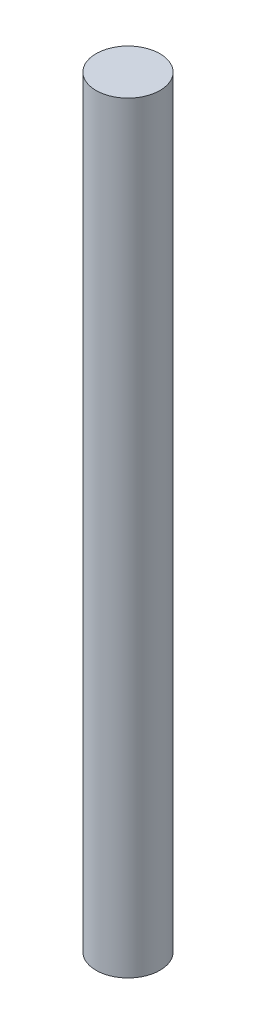
ISO-10303-21;
HEADER;
FILE_DESCRIPTION(('STEP AP214'),'2;1');
FILE_NAME('part.step','',(''),(''),'','','');
FILE_SCHEMA(('AUTOMOTIVE_DESIGN { 1 0 10303 214 1 1 1 1 }'));
ENDSEC;
DATA;
#1=APPLICATION_CONTEXT('core data for automotive mechanical design processes');
#2=APPLICATION_PROTOCOL_DEFINITION('international standard','automotive_design',2000,#1);
#3=PRODUCT_CONTEXT('',#1,'mechanical');
#4=PRODUCT('Part','Part','',(#3));
#5=PRODUCT_RELATED_PRODUCT_CATEGORY('part','',(#4));
#6=PRODUCT_DEFINITION_FORMATION('','',#4);
#7=PRODUCT_DEFINITION_CONTEXT('part definition',#1,'design');
#8=PRODUCT_DEFINITION('design','',#6,#7);
#9=PRODUCT_DEFINITION_SHAPE('','',#8);
#10=(LENGTH_UNIT() NAMED_UNIT(*) SI_UNIT(.MILLI.,.METRE.));
#11=(NAMED_UNIT(*) PLANE_ANGLE_UNIT() SI_UNIT($,.RADIAN.));
#12=(NAMED_UNIT(*) SI_UNIT($,.STERADIAN.) SOLID_ANGLE_UNIT());
#13=UNCERTAINTY_MEASURE_WITH_UNIT(LENGTH_MEASURE(1.E-05),#10,'distance_accuracy_value','');
#14=(GEOMETRIC_REPRESENTATION_CONTEXT(3) GLOBAL_UNCERTAINTY_ASSIGNED_CONTEXT((#13)) GLOBAL_UNIT_ASSIGNED_CONTEXT((#10,
#11,#12)) REPRESENTATION_CONTEXT('',''));
#15=CARTESIAN_POINT('',(0.,0.,0.));
#16=DIRECTION('',(0.,0.,1.));
#17=DIRECTION('',(1.,0.,0.));
#18=AXIS2_PLACEMENT_3D('',#15,#16,#17);
#19=CARTESIAN_POINT('',(0.,45.466,0.));
#20=DIRECTION('',(0.,-1.,0.));
#21=DIRECTION('',(0.,0.,-1.));
#22=AXIS2_PLACEMENT_3D('',#19,#20,#21);
#23=CYLINDRICAL_SURFACE('',#22,1.905);
#24=CARTESIAN_POINT('',(0.,45.466,0.));
#25=DIRECTION('',(0.,1.,0.));
#26=DIRECTION('',(0.,0.,1.));
#27=AXIS2_PLACEMENT_3D('',#24,#25,#26);
#28=CIRCLE('',#27,1.905);
#29=CARTESIAN_POINT('',(0.,45.466,1.905));
#30=VERTEX_POINT('',#29);
#31=EDGE_CURVE('E10',#30,#30,#28,.T.);
#32=ORIENTED_EDGE('',*,*,#31,.F.);
#33=EDGE_LOOP('',(#32));
#34=FACE_BOUND('',#33,.T.);
#35=CARTESIAN_POINT('',(0.,0.,0.));
#36=DIRECTION('',(0.,1.,0.));
#37=DIRECTION('',(0.,0.,1.));
#38=AXIS2_PLACEMENT_3D('',#35,#36,#37);
#39=CIRCLE('',#38,1.905);
#40=CARTESIAN_POINT('',(0.,0.,1.905));
#41=VERTEX_POINT('',#40);
#42=EDGE_CURVE('E34',#41,#41,#39,.T.);
#43=ORIENTED_EDGE('',*,*,#42,.T.);
#44=EDGE_LOOP('',(#43));
#45=FACE_BOUND('',#44,.T.);
#46=ADVANCED_FACE('F31',(#34,#45),#23,.T.);
#47=CARTESIAN_POINT('',(0.,45.466,0.));
#48=DIRECTION('',(0.,1.,0.));
#49=DIRECTION('',(0.,0.,1.));
#50=AXIS2_PLACEMENT_3D('',#47,#48,#49);
#51=PLANE('',#50);
#52=ORIENTED_EDGE('',*,*,#31,.T.);
#53=EDGE_LOOP('',(#52));
#54=FACE_BOUND('',#53,.T.);
#55=ADVANCED_FACE('F46',(#54),#51,.T.);
#56=CARTESIAN_POINT('',(0.,0.,0.));
#57=DIRECTION('',(0.,1.,0.));
#58=DIRECTION('',(0.,0.,1.));
#59=AXIS2_PLACEMENT_3D('',#56,#57,#58);
#60=PLANE('',#59);
#61=ORIENTED_EDGE('',*,*,#42,.F.);
#62=EDGE_LOOP('',(#61));
#63=FACE_BOUND('',#62,.T.);
#64=ADVANCED_FACE('F44',(#63),#60,.F.);
#65=CLOSED_SHELL('',(#46,#55,#64));
#66=MANIFOLD_SOLID_BREP('B2',#65);
#67=ADVANCED_BREP_SHAPE_REPRESENTATION('',(#18,#66),#14);
#68=SHAPE_DEFINITION_REPRESENTATION(#9,#67);
ENDSEC;
END-ISO-10303-21;
